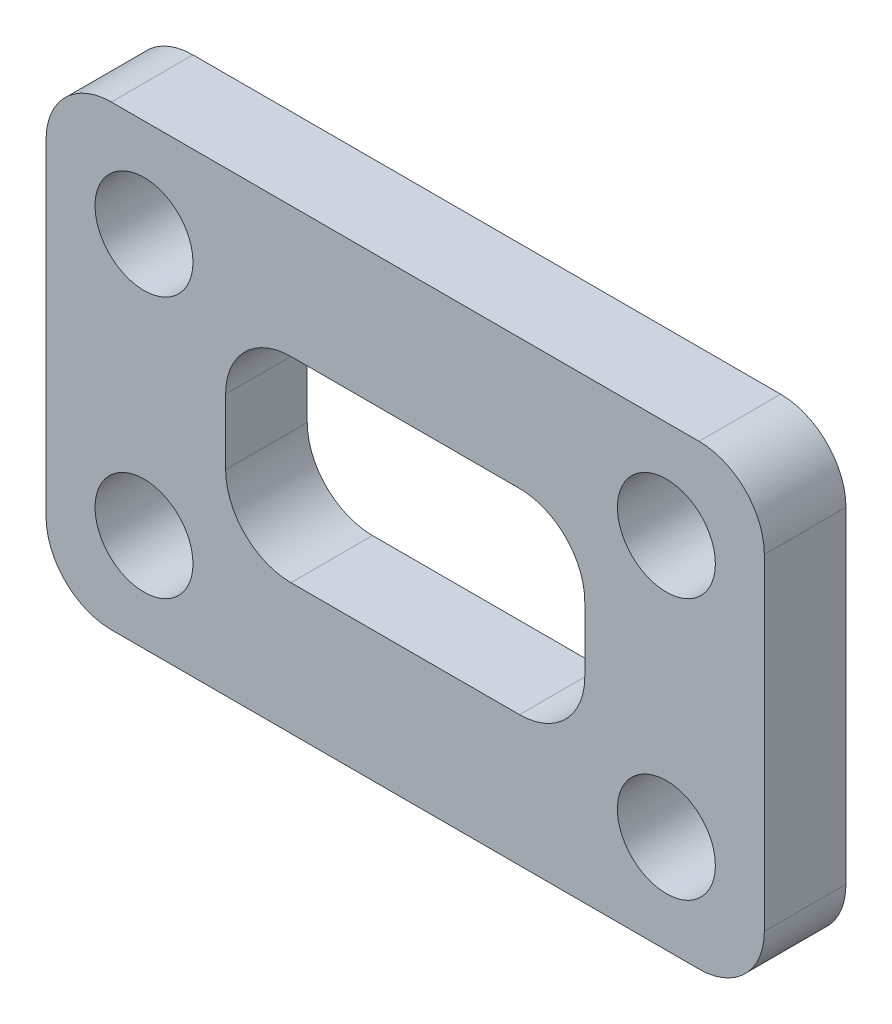
ISO-10303-21;
HEADER;
FILE_DESCRIPTION(('STEP AP214'),'2;1');
FILE_NAME('part.step','',(''),(''),'','','');
FILE_SCHEMA(('AUTOMOTIVE_DESIGN { 1 0 10303 214 1 1 1 1 }'));
ENDSEC;
DATA;
#1=APPLICATION_CONTEXT('core data for automotive mechanical design processes');
#2=APPLICATION_PROTOCOL_DEFINITION('international standard','automotive_design',2000,#1);
#3=PRODUCT_CONTEXT('',#1,'mechanical');
#4=PRODUCT('Part','Part','',(#3));
#5=PRODUCT_RELATED_PRODUCT_CATEGORY('part','',(#4));
#6=PRODUCT_DEFINITION_FORMATION('','',#4);
#7=PRODUCT_DEFINITION_CONTEXT('part definition',#1,'design');
#8=PRODUCT_DEFINITION('design','',#6,#7);
#9=PRODUCT_DEFINITION_SHAPE('','',#8);
#10=(LENGTH_UNIT() NAMED_UNIT(*) SI_UNIT(.MILLI.,.METRE.));
#11=(NAMED_UNIT(*) PLANE_ANGLE_UNIT() SI_UNIT($,.RADIAN.));
#12=(NAMED_UNIT(*) SI_UNIT($,.STERADIAN.) SOLID_ANGLE_UNIT());
#13=UNCERTAINTY_MEASURE_WITH_UNIT(LENGTH_MEASURE(1.E-05),#10,'distance_accuracy_value','');
#14=(GEOMETRIC_REPRESENTATION_CONTEXT(3) GLOBAL_UNCERTAINTY_ASSIGNED_CONTEXT((#13)) GLOBAL_UNIT_ASSIGNED_CONTEXT((#10,
#11,#12)) REPRESENTATION_CONTEXT('',''));
#15=CARTESIAN_POINT('',(0.,0.,0.));
#16=DIRECTION('',(0.,0.,1.));
#17=DIRECTION('',(1.,0.,0.));
#18=AXIS2_PLACEMENT_3D('',#15,#16,#17);
#19=CARTESIAN_POINT('',(0.,0.,2.5));
#20=DIRECTION('',(0.,0.,-1.));
#21=DIRECTION('',(-1.,0.,0.));
#22=AXIS2_PLACEMENT_3D('',#19,#20,#21);
#23=PLANE('',#22);
#24=CARTESIAN_POINT('',(-8.,4.,2.5));
#25=DIRECTION('',(0.,0.,1.));
#26=DIRECTION('',(1.,0.,0.));
#27=AXIS2_PLACEMENT_3D('',#24,#25,#26);
#28=CIRCLE('',#27,1.5);
#29=CARTESIAN_POINT('',(-6.5,4.,2.5));
#30=VERTEX_POINT('',#29);
#31=EDGE_CURVE('E285',#30,#30,#28,.T.);
#32=ORIENTED_EDGE('',*,*,#31,.F.);
#33=EDGE_LOOP('',(#32));
#34=FACE_BOUND('',#33,.T.);
#35=CARTESIAN_POINT('',(-8.,-4.,2.5));
#36=DIRECTION('',(0.,0.,1.));
#37=DIRECTION('',(1.,0.,0.));
#38=AXIS2_PLACEMENT_3D('',#35,#36,#37);
#39=CIRCLE('',#38,1.5);
#40=CARTESIAN_POINT('',(-6.5,-4.,2.5));
#41=VERTEX_POINT('',#40);
#42=EDGE_CURVE('E291',#41,#41,#39,.T.);
#43=ORIENTED_EDGE('',*,*,#42,.F.);
#44=EDGE_LOOP('',(#43));
#45=FACE_BOUND('',#44,.T.);
#46=CARTESIAN_POINT('',(8.,-4.,2.5));
#47=DIRECTION('',(0.,0.,1.));
#48=DIRECTION('',(1.,0.,0.));
#49=AXIS2_PLACEMENT_3D('',#46,#47,#48);
#50=CIRCLE('',#49,1.5);
#51=CARTESIAN_POINT('',(9.5,-4.,2.5));
#52=VERTEX_POINT('',#51);
#53=EDGE_CURVE('E297',#52,#52,#50,.T.);
#54=ORIENTED_EDGE('',*,*,#53,.F.);
#55=EDGE_LOOP('',(#54));
#56=FACE_BOUND('',#55,.T.);
#57=CARTESIAN_POINT('',(8.,4.,2.5));
#58=DIRECTION('',(0.,0.,1.));
#59=DIRECTION('',(1.,0.,0.));
#60=AXIS2_PLACEMENT_3D('',#57,#58,#59);
#61=CIRCLE('',#60,1.5);
#62=CARTESIAN_POINT('',(9.5,4.,2.5));
#63=VERTEX_POINT('',#62);
#64=EDGE_CURVE('E303',#63,#63,#61,.T.);
#65=ORIENTED_EDGE('',*,*,#64,.F.);
#66=EDGE_LOOP('',(#65));
#67=FACE_BOUND('',#66,.T.);
#68=DIRECTION('',(1.,0.,0.));
#69=VECTOR('',#68,1.);
#70=CARTESIAN_POINT('',(-11.,-7.,2.5));
#71=LINE('',#70,#69);
#72=CARTESIAN_POINT('',(-9.,-7.,2.5));
#73=VERTEX_POINT('',#72);
#74=CARTESIAN_POINT('',(9.,-7.,2.5));
#75=VERTEX_POINT('',#74);
#76=EDGE_CURVE('E186',#73,#75,#71,.T.);
#77=ORIENTED_EDGE('',*,*,#76,.T.);
#78=CARTESIAN_POINT('',(9.,-5.,2.5));
#79=DIRECTION('',(0.,0.,-1.));
#80=DIRECTION('',(-1.,0.,0.));
#81=AXIS2_PLACEMENT_3D('',#78,#79,#80);
#82=CIRCLE('',#81,2.);
#83=CARTESIAN_POINT('',(11.,-5.,2.5));
#84=VERTEX_POINT('',#83);
#85=EDGE_CURVE('E233',#75,#84,#82,.F.);
#86=ORIENTED_EDGE('',*,*,#85,.T.);
#87=DIRECTION('',(0.,1.,0.));
#88=VECTOR('',#87,1.);
#89=CARTESIAN_POINT('',(11.,-7.,2.5));
#90=LINE('',#89,#88);
#91=CARTESIAN_POINT('',(11.,5.,2.5));
#92=VERTEX_POINT('',#91);
#93=EDGE_CURVE('E309',#84,#92,#90,.T.);
#94=ORIENTED_EDGE('',*,*,#93,.T.);
#95=CARTESIAN_POINT('',(9.,5.,2.5));
#96=DIRECTION('',(0.,0.,-1.));
#97=DIRECTION('',(-1.,0.,0.));
#98=AXIS2_PLACEMENT_3D('',#95,#96,#97);
#99=CIRCLE('',#98,2.);
#100=CARTESIAN_POINT('',(9.,7.,2.5));
#101=VERTEX_POINT('',#100);
#102=EDGE_CURVE('E228',#92,#101,#99,.F.);
#103=ORIENTED_EDGE('',*,*,#102,.T.);
#104=DIRECTION('',(-1.,0.,0.));
#105=VECTOR('',#104,1.);
#106=CARTESIAN_POINT('',(-11.,7.,2.5));
#107=LINE('',#106,#105);
#108=CARTESIAN_POINT('',(-9.,7.,2.5));
#109=VERTEX_POINT('',#108);
#110=EDGE_CURVE('E312',#101,#109,#107,.T.);
#111=ORIENTED_EDGE('',*,*,#110,.T.);
#112=CARTESIAN_POINT('',(-9.,5.,2.5));
#113=DIRECTION('',(0.,0.,-1.));
#114=DIRECTION('',(-1.,0.,0.));
#115=AXIS2_PLACEMENT_3D('',#112,#113,#114);
#116=CIRCLE('',#115,2.);
#117=CARTESIAN_POINT('',(-11.,5.,2.5));
#118=VERTEX_POINT('',#117);
#119=EDGE_CURVE('E68',#109,#118,#116,.F.);
#120=ORIENTED_EDGE('',*,*,#119,.T.);
#121=DIRECTION('',(0.,-1.,0.));
#122=VECTOR('',#121,1.);
#123=CARTESIAN_POINT('',(-11.,-7.,2.5));
#124=LINE('',#123,#122);
#125=CARTESIAN_POINT('',(-11.,-5.,2.5));
#126=VERTEX_POINT('',#125);
#127=EDGE_CURVE('E191',#118,#126,#124,.T.);
#128=ORIENTED_EDGE('',*,*,#127,.T.);
#129=CARTESIAN_POINT('',(-9.,-5.,2.5));
#130=DIRECTION('',(0.,0.,-1.));
#131=DIRECTION('',(-1.,0.,0.));
#132=AXIS2_PLACEMENT_3D('',#129,#130,#131);
#133=CIRCLE('',#132,2.);
#134=EDGE_CURVE('E231',#126,#73,#133,.F.);
#135=ORIENTED_EDGE('',*,*,#134,.T.);
#136=EDGE_LOOP('',(#77,#86,#94,#103,#111,#120,#128,#135));
#137=FACE_BOUND('',#136,.T.);
#138=DIRECTION('',(0.,1.,0.));
#139=VECTOR('',#138,1.);
#140=CARTESIAN_POINT('',(5.49999999999999,-3.,2.5));
#141=LINE('',#140,#139);
#142=CARTESIAN_POINT('',(5.49999999999999,-1.,2.5));
#143=VERTEX_POINT('',#142);
#144=CARTESIAN_POINT('',(5.49999999999999,0.999999999999999,2.5));
#145=VERTEX_POINT('',#144);
#146=EDGE_CURVE('E274',#143,#145,#141,.T.);
#147=ORIENTED_EDGE('',*,*,#146,.F.);
#148=CARTESIAN_POINT('',(3.49999999999999,-1.,2.5));
#149=DIRECTION('',(0.,0.,-1.));
#150=DIRECTION('',(-1.,0.,0.));
#151=AXIS2_PLACEMENT_3D('',#148,#149,#150);
#152=CIRCLE('',#151,2.);
#153=CARTESIAN_POINT('',(3.49999999999999,-3.,2.5));
#154=VERTEX_POINT('',#153);
#155=EDGE_CURVE('E171',#143,#154,#152,.T.);
#156=ORIENTED_EDGE('',*,*,#155,.T.);
#157=DIRECTION('',(1.,0.,0.));
#158=VECTOR('',#157,1.);
#159=CARTESIAN_POINT('',(-5.5,-3.,2.5));
#160=LINE('',#159,#158);
#161=CARTESIAN_POINT('',(-3.5,-3.,2.5));
#162=VERTEX_POINT('',#161);
#163=EDGE_CURVE('E276',#162,#154,#160,.T.);
#164=ORIENTED_EDGE('',*,*,#163,.F.);
#165=CARTESIAN_POINT('',(-3.5,-1.,2.5));
#166=DIRECTION('',(0.,0.,-1.));
#167=DIRECTION('',(-1.,0.,0.));
#168=AXIS2_PLACEMENT_3D('',#165,#166,#167);
#169=CIRCLE('',#168,2.);
#170=CARTESIAN_POINT('',(-5.5,-1.,2.5));
#171=VERTEX_POINT('',#170);
#172=EDGE_CURVE('E172',#162,#171,#169,.T.);
#173=ORIENTED_EDGE('',*,*,#172,.T.);
#174=DIRECTION('',(0.,-1.,0.));
#175=VECTOR('',#174,1.);
#176=CARTESIAN_POINT('',(-5.5,-3.,2.5));
#177=LINE('',#176,#175);
#178=CARTESIAN_POINT('',(-5.5,0.999999999999999,2.5));
#179=VERTEX_POINT('',#178);
#180=EDGE_CURVE('E270',#179,#171,#177,.T.);
#181=ORIENTED_EDGE('',*,*,#180,.F.);
#182=CARTESIAN_POINT('',(-3.5,1.,2.5));
#183=DIRECTION('',(0.,0.,-1.));
#184=DIRECTION('',(-1.,0.,0.));
#185=AXIS2_PLACEMENT_3D('',#182,#183,#184);
#186=CIRCLE('',#185,2.);
#187=CARTESIAN_POINT('',(-3.5,3.,2.5));
#188=VERTEX_POINT('',#187);
#189=EDGE_CURVE('E11',#179,#188,#186,.T.);
#190=ORIENTED_EDGE('',*,*,#189,.T.);
#191=DIRECTION('',(-1.,0.,0.));
#192=VECTOR('',#191,1.);
#193=CARTESIAN_POINT('',(-5.5,3.,2.5));
#194=LINE('',#193,#192);
#195=CARTESIAN_POINT('',(3.49999999999999,3.,2.5));
#196=VERTEX_POINT('',#195);
#197=EDGE_CURVE('E268',#196,#188,#194,.T.);
#198=ORIENTED_EDGE('',*,*,#197,.F.);
#199=CARTESIAN_POINT('',(3.49999999999999,1.,2.5));
#200=DIRECTION('',(0.,0.,-1.));
#201=DIRECTION('',(-1.,0.,0.));
#202=AXIS2_PLACEMENT_3D('',#199,#200,#201);
#203=CIRCLE('',#202,2.);
#204=EDGE_CURVE('E246',#196,#145,#203,.T.);
#205=ORIENTED_EDGE('',*,*,#204,.T.);
#206=EDGE_LOOP('',(#147,#156,#164,#173,#181,#190,#198,#205));
#207=FACE_BOUND('',#206,.T.);
#208=ADVANCED_FACE('F46',(#34,#45,#56,#67,#137,#207),#23,.F.);
#209=CARTESIAN_POINT('',(0.,0.,0.));
#210=DIRECTION('',(0.,0.,-1.));
#211=DIRECTION('',(-1.,0.,0.));
#212=AXIS2_PLACEMENT_3D('',#209,#210,#211);
#213=PLANE('',#212);
#214=CARTESIAN_POINT('',(-8.,-4.,0.));
#215=DIRECTION('',(0.,0.,1.));
#216=DIRECTION('',(1.,0.,0.));
#217=AXIS2_PLACEMENT_3D('',#214,#215,#216);
#218=CIRCLE('',#217,1.5);
#219=CARTESIAN_POINT('',(-6.5,-4.,0.));
#220=VERTEX_POINT('',#219);
#221=EDGE_CURVE('E288',#220,#220,#218,.T.);
#222=ORIENTED_EDGE('',*,*,#221,.T.);
#223=EDGE_LOOP('',(#222));
#224=FACE_BOUND('',#223,.T.);
#225=CARTESIAN_POINT('',(8.,4.,0.));
#226=DIRECTION('',(0.,0.,1.));
#227=DIRECTION('',(1.,0.,0.));
#228=AXIS2_PLACEMENT_3D('',#225,#226,#227);
#229=CIRCLE('',#228,1.5);
#230=CARTESIAN_POINT('',(9.5,4.,0.));
#231=VERTEX_POINT('',#230);
#232=EDGE_CURVE('E300',#231,#231,#229,.T.);
#233=ORIENTED_EDGE('',*,*,#232,.T.);
#234=EDGE_LOOP('',(#233));
#235=FACE_BOUND('',#234,.T.);
#236=DIRECTION('',(0.,1.,0.));
#237=VECTOR('',#236,1.);
#238=CARTESIAN_POINT('',(11.,-7.,0.));
#239=LINE('',#238,#237);
#240=CARTESIAN_POINT('',(11.,-5.,0.));
#241=VERTEX_POINT('',#240);
#242=CARTESIAN_POINT('',(11.,5.,0.));
#243=VERTEX_POINT('',#242);
#244=EDGE_CURVE('E306',#241,#243,#239,.T.);
#245=ORIENTED_EDGE('',*,*,#244,.F.);
#246=CARTESIAN_POINT('',(9.,-5.,0.));
#247=DIRECTION('',(0.,0.,-1.));
#248=DIRECTION('',(-1.,0.,0.));
#249=AXIS2_PLACEMENT_3D('',#246,#247,#248);
#250=CIRCLE('',#249,2.);
#251=CARTESIAN_POINT('',(9.,-7.,0.));
#252=VERTEX_POINT('',#251);
#253=EDGE_CURVE('E221',#241,#252,#250,.T.);
#254=ORIENTED_EDGE('',*,*,#253,.T.);
#255=DIRECTION('',(1.,0.,0.));
#256=VECTOR('',#255,1.);
#257=CARTESIAN_POINT('',(-11.,-7.,0.));
#258=LINE('',#257,#256);
#259=CARTESIAN_POINT('',(-9.,-7.,0.));
#260=VERTEX_POINT('',#259);
#261=EDGE_CURVE('E194',#260,#252,#258,.T.);
#262=ORIENTED_EDGE('',*,*,#261,.F.);
#263=CARTESIAN_POINT('',(-9.,-5.,0.));
#264=DIRECTION('',(0.,0.,-1.));
#265=DIRECTION('',(-1.,0.,0.));
#266=AXIS2_PLACEMENT_3D('',#263,#264,#265);
#267=CIRCLE('',#266,2.);
#268=CARTESIAN_POINT('',(-11.,-5.,0.));
#269=VERTEX_POINT('',#268);
#270=EDGE_CURVE('E219',#260,#269,#267,.T.);
#271=ORIENTED_EDGE('',*,*,#270,.T.);
#272=DIRECTION('',(0.,-1.,0.));
#273=VECTOR('',#272,1.);
#274=CARTESIAN_POINT('',(-11.,-7.,0.));
#275=LINE('',#274,#273);
#276=CARTESIAN_POINT('',(-11.,5.,0.));
#277=VERTEX_POINT('',#276);
#278=EDGE_CURVE('E319',#277,#269,#275,.T.);
#279=ORIENTED_EDGE('',*,*,#278,.F.);
#280=CARTESIAN_POINT('',(-9.,5.,0.));
#281=DIRECTION('',(0.,0.,-1.));
#282=DIRECTION('',(-1.,0.,0.));
#283=AXIS2_PLACEMENT_3D('',#280,#281,#282);
#284=CIRCLE('',#283,2.);
#285=CARTESIAN_POINT('',(-9.,7.,0.));
#286=VERTEX_POINT('',#285);
#287=EDGE_CURVE('E217',#277,#286,#284,.T.);
#288=ORIENTED_EDGE('',*,*,#287,.T.);
#289=DIRECTION('',(-1.,0.,0.));
#290=VECTOR('',#289,1.);
#291=CARTESIAN_POINT('',(-11.,7.,0.));
#292=LINE('',#291,#290);
#293=CARTESIAN_POINT('',(9.,7.,0.));
#294=VERTEX_POINT('',#293);
#295=EDGE_CURVE('E317',#294,#286,#292,.T.);
#296=ORIENTED_EDGE('',*,*,#295,.F.);
#297=CARTESIAN_POINT('',(9.,5.,0.));
#298=DIRECTION('',(0.,0.,-1.));
#299=DIRECTION('',(-1.,0.,0.));
#300=AXIS2_PLACEMENT_3D('',#297,#298,#299);
#301=CIRCLE('',#300,2.);
#302=EDGE_CURVE('E215',#294,#243,#301,.T.);
#303=ORIENTED_EDGE('',*,*,#302,.T.);
#304=EDGE_LOOP('',(#245,#254,#262,#271,#279,#288,#296,#303));
#305=FACE_BOUND('',#304,.T.);
#306=CARTESIAN_POINT('',(8.,-4.,0.));
#307=DIRECTION('',(0.,0.,1.));
#308=DIRECTION('',(1.,0.,0.));
#309=AXIS2_PLACEMENT_3D('',#306,#307,#308);
#310=CIRCLE('',#309,1.5);
#311=CARTESIAN_POINT('',(9.5,-4.,0.));
#312=VERTEX_POINT('',#311);
#313=EDGE_CURVE('E294',#312,#312,#310,.T.);
#314=ORIENTED_EDGE('',*,*,#313,.T.);
#315=EDGE_LOOP('',(#314));
#316=FACE_BOUND('',#315,.T.);
#317=CARTESIAN_POINT('',(-8.,4.,0.));
#318=DIRECTION('',(0.,0.,1.));
#319=DIRECTION('',(1.,0.,0.));
#320=AXIS2_PLACEMENT_3D('',#317,#318,#319);
#321=CIRCLE('',#320,1.5);
#322=CARTESIAN_POINT('',(-6.5,4.,0.));
#323=VERTEX_POINT('',#322);
#324=EDGE_CURVE('E281',#323,#323,#321,.T.);
#325=ORIENTED_EDGE('',*,*,#324,.T.);
#326=EDGE_LOOP('',(#325));
#327=FACE_BOUND('',#326,.T.);
#328=DIRECTION('',(0.,-1.,0.));
#329=VECTOR('',#328,1.);
#330=CARTESIAN_POINT('',(-5.5,-3.,0.));
#331=LINE('',#330,#329);
#332=CARTESIAN_POINT('',(-5.5,0.999999999999999,0.));
#333=VERTEX_POINT('',#332);
#334=CARTESIAN_POINT('',(-5.5,-1.,0.));
#335=VERTEX_POINT('',#334);
#336=EDGE_CURVE('E253',#333,#335,#331,.T.);
#337=ORIENTED_EDGE('',*,*,#336,.T.);
#338=CARTESIAN_POINT('',(-3.5,-1.,0.));
#339=DIRECTION('',(0.,0.,-1.));
#340=DIRECTION('',(-1.,0.,0.));
#341=AXIS2_PLACEMENT_3D('',#338,#339,#340);
#342=CIRCLE('',#341,2.);
#343=CARTESIAN_POINT('',(-3.5,-3.,0.));
#344=VERTEX_POINT('',#343);
#345=EDGE_CURVE('E248',#335,#344,#342,.F.);
#346=ORIENTED_EDGE('',*,*,#345,.T.);
#347=DIRECTION('',(1.,0.,0.));
#348=VECTOR('',#347,1.);
#349=CARTESIAN_POINT('',(-5.5,-3.,0.));
#350=LINE('',#349,#348);
#351=CARTESIAN_POINT('',(3.49999999999999,-3.,0.));
#352=VERTEX_POINT('',#351);
#353=EDGE_CURVE('E166',#344,#352,#350,.T.);
#354=ORIENTED_EDGE('',*,*,#353,.T.);
#355=CARTESIAN_POINT('',(3.49999999999999,-1.,0.));
#356=DIRECTION('',(0.,0.,-1.));
#357=DIRECTION('',(-1.,0.,0.));
#358=AXIS2_PLACEMENT_3D('',#355,#356,#357);
#359=CIRCLE('',#358,2.);
#360=CARTESIAN_POINT('',(5.49999999999999,-1.,0.));
#361=VERTEX_POINT('',#360);
#362=EDGE_CURVE('E160',#352,#361,#359,.F.);
#363=ORIENTED_EDGE('',*,*,#362,.T.);
#364=DIRECTION('',(0.,1.,0.));
#365=VECTOR('',#364,1.);
#366=CARTESIAN_POINT('',(5.49999999999999,-3.,0.));
#367=LINE('',#366,#365);
#368=CARTESIAN_POINT('',(5.49999999999999,0.999999999999999,0.));
#369=VERTEX_POINT('',#368);
#370=EDGE_CURVE('E164',#361,#369,#367,.T.);
#371=ORIENTED_EDGE('',*,*,#370,.T.);
#372=CARTESIAN_POINT('',(3.49999999999999,1.,0.));
#373=DIRECTION('',(0.,0.,-1.));
#374=DIRECTION('',(-1.,0.,0.));
#375=AXIS2_PLACEMENT_3D('',#372,#373,#374);
#376=CIRCLE('',#375,2.);
#377=CARTESIAN_POINT('',(3.49999999999999,3.,0.));
#378=VERTEX_POINT('',#377);
#379=EDGE_CURVE('E244',#369,#378,#376,.F.);
#380=ORIENTED_EDGE('',*,*,#379,.T.);
#381=DIRECTION('',(-1.,0.,0.));
#382=VECTOR('',#381,1.);
#383=CARTESIAN_POINT('',(-5.5,3.,0.));
#384=LINE('',#383,#382);
#385=CARTESIAN_POINT('',(-3.5,3.,0.));
#386=VERTEX_POINT('',#385);
#387=EDGE_CURVE('E182',#378,#386,#384,.T.);
#388=ORIENTED_EDGE('',*,*,#387,.T.);
#389=CARTESIAN_POINT('',(-3.5,1.,0.));
#390=DIRECTION('',(0.,0.,-1.));
#391=DIRECTION('',(-1.,0.,0.));
#392=AXIS2_PLACEMENT_3D('',#389,#390,#391);
#393=CIRCLE('',#392,2.);
#394=EDGE_CURVE('E54',#386,#333,#393,.F.);
#395=ORIENTED_EDGE('',*,*,#394,.T.);
#396=EDGE_LOOP('',(#337,#346,#354,#363,#371,#380,#388,#395));
#397=FACE_BOUND('',#396,.T.);
#398=ADVANCED_FACE('F163',(#224,#235,#305,#316,#327,#397),#213,.T.);
#399=CARTESIAN_POINT('',(11.,-7.,2.5));
#400=DIRECTION('',(-1.,0.,0.));
#401=DIRECTION('',(0.,0.,1.));
#402=AXIS2_PLACEMENT_3D('',#399,#400,#401);
#403=PLANE('',#402);
#404=ORIENTED_EDGE('',*,*,#93,.F.);
#405=DIRECTION('',(0.,0.,-1.));
#406=VECTOR('',#405,1.);
#407=CARTESIAN_POINT('',(11.,-5.,2.5));
#408=LINE('',#407,#406);
#409=EDGE_CURVE('E212',#84,#241,#408,.T.);
#410=ORIENTED_EDGE('',*,*,#409,.T.);
#411=ORIENTED_EDGE('',*,*,#244,.T.);
#412=DIRECTION('',(0.,0.,-1.));
#413=VECTOR('',#412,1.);
#414=CARTESIAN_POINT('',(11.,5.,2.5));
#415=LINE('',#414,#413);
#416=EDGE_CURVE('E210',#243,#92,#415,.F.);
#417=ORIENTED_EDGE('',*,*,#416,.T.);
#418=EDGE_LOOP('',(#404,#410,#411,#417));
#419=FACE_BOUND('',#418,.T.);
#420=ADVANCED_FACE('F336',(#419),#403,.F.);
#421=CARTESIAN_POINT('',(-11.,7.,2.5));
#422=DIRECTION('',(0.,-1.,0.));
#423=DIRECTION('',(0.,0.,-1.));
#424=AXIS2_PLACEMENT_3D('',#421,#422,#423);
#425=PLANE('',#424);
#426=ORIENTED_EDGE('',*,*,#295,.T.);
#427=DIRECTION('',(0.,0.,-1.));
#428=VECTOR('',#427,1.);
#429=CARTESIAN_POINT('',(-9.,7.,2.5));
#430=LINE('',#429,#428);
#431=EDGE_CURVE('E242',#286,#109,#430,.F.);
#432=ORIENTED_EDGE('',*,*,#431,.T.);
#433=ORIENTED_EDGE('',*,*,#110,.F.);
#434=DIRECTION('',(0.,0.,-1.));
#435=VECTOR('',#434,1.);
#436=CARTESIAN_POINT('',(9.,7.,2.5));
#437=LINE('',#436,#435);
#438=EDGE_CURVE('E239',#101,#294,#437,.T.);
#439=ORIENTED_EDGE('',*,*,#438,.T.);
#440=EDGE_LOOP('',(#426,#432,#433,#439));
#441=FACE_BOUND('',#440,.T.);
#442=ADVANCED_FACE('F344',(#441),#425,.F.);
#443=CARTESIAN_POINT('',(-11.,-7.,2.5));
#444=DIRECTION('',(1.,0.,0.));
#445=DIRECTION('',(0.,0.,-1.));
#446=AXIS2_PLACEMENT_3D('',#443,#444,#445);
#447=PLANE('',#446);
#448=ORIENTED_EDGE('',*,*,#278,.T.);
#449=DIRECTION('',(0.,0.,-1.));
#450=VECTOR('',#449,1.);
#451=CARTESIAN_POINT('',(-11.,-5.,2.5));
#452=LINE('',#451,#450);
#453=EDGE_CURVE('E61',#269,#126,#452,.F.);
#454=ORIENTED_EDGE('',*,*,#453,.T.);
#455=ORIENTED_EDGE('',*,*,#127,.F.);
#456=DIRECTION('',(0.,0.,-1.));
#457=VECTOR('',#456,1.);
#458=CARTESIAN_POINT('',(-11.,5.,2.5));
#459=LINE('',#458,#457);
#460=EDGE_CURVE('E235',#118,#277,#459,.T.);
#461=ORIENTED_EDGE('',*,*,#460,.T.);
#462=EDGE_LOOP('',(#448,#454,#455,#461));
#463=FACE_BOUND('',#462,.T.);
#464=ADVANCED_FACE('F350',(#463),#447,.F.);
#465=CARTESIAN_POINT('',(-11.,-7.,2.5));
#466=DIRECTION('',(0.,1.,0.));
#467=DIRECTION('',(0.,0.,1.));
#468=AXIS2_PLACEMENT_3D('',#465,#466,#467);
#469=PLANE('',#468);
#470=ORIENTED_EDGE('',*,*,#261,.T.);
#471=DIRECTION('',(0.,0.,-1.));
#472=VECTOR('',#471,1.);
#473=CARTESIAN_POINT('',(9.,-7.,2.5));
#474=LINE('',#473,#472);
#475=EDGE_CURVE('E226',#252,#75,#474,.F.);
#476=ORIENTED_EDGE('',*,*,#475,.T.);
#477=ORIENTED_EDGE('',*,*,#76,.F.);
#478=DIRECTION('',(0.,0.,-1.));
#479=VECTOR('',#478,1.);
#480=CARTESIAN_POINT('',(-9.,-7.,2.5));
#481=LINE('',#480,#479);
#482=EDGE_CURVE('E223',#73,#260,#481,.T.);
#483=ORIENTED_EDGE('',*,*,#482,.T.);
#484=EDGE_LOOP('',(#470,#476,#477,#483));
#485=FACE_BOUND('',#484,.T.);
#486=ADVANCED_FACE('F325',(#485),#469,.F.);
#487=CARTESIAN_POINT('',(8.,4.,2.5));
#488=DIRECTION('',(0.,0.,-1.));
#489=DIRECTION('',(-1.,0.,0.));
#490=AXIS2_PLACEMENT_3D('',#487,#488,#489);
#491=CYLINDRICAL_SURFACE('',#490,1.5);
#492=ORIENTED_EDGE('',*,*,#64,.T.);
#493=EDGE_LOOP('',(#492));
#494=FACE_BOUND('',#493,.T.);
#495=ORIENTED_EDGE('',*,*,#232,.F.);
#496=EDGE_LOOP('',(#495));
#497=FACE_BOUND('',#496,.T.);
#498=ADVANCED_FACE('F374',(#494,#497),#491,.F.);
#499=CARTESIAN_POINT('',(8.,-4.,2.5));
#500=DIRECTION('',(0.,0.,-1.));
#501=DIRECTION('',(-1.,0.,0.));
#502=AXIS2_PLACEMENT_3D('',#499,#500,#501);
#503=CYLINDRICAL_SURFACE('',#502,1.5);
#504=ORIENTED_EDGE('',*,*,#53,.T.);
#505=EDGE_LOOP('',(#504));
#506=FACE_BOUND('',#505,.T.);
#507=ORIENTED_EDGE('',*,*,#313,.F.);
#508=EDGE_LOOP('',(#507));
#509=FACE_BOUND('',#508,.T.);
#510=ADVANCED_FACE('F505',(#506,#509),#503,.F.);
#511=CARTESIAN_POINT('',(-8.,-4.,2.5));
#512=DIRECTION('',(0.,0.,-1.));
#513=DIRECTION('',(-1.,0.,0.));
#514=AXIS2_PLACEMENT_3D('',#511,#512,#513);
#515=CYLINDRICAL_SURFACE('',#514,1.5);
#516=ORIENTED_EDGE('',*,*,#42,.T.);
#517=EDGE_LOOP('',(#516));
#518=FACE_BOUND('',#517,.T.);
#519=ORIENTED_EDGE('',*,*,#221,.F.);
#520=EDGE_LOOP('',(#519));
#521=FACE_BOUND('',#520,.T.);
#522=ADVANCED_FACE('F495',(#518,#521),#515,.F.);
#523=CARTESIAN_POINT('',(-8.,4.,2.5));
#524=DIRECTION('',(0.,0.,-1.));
#525=DIRECTION('',(-1.,0.,0.));
#526=AXIS2_PLACEMENT_3D('',#523,#524,#525);
#527=CYLINDRICAL_SURFACE('',#526,1.5);
#528=ORIENTED_EDGE('',*,*,#31,.T.);
#529=EDGE_LOOP('',(#528));
#530=FACE_BOUND('',#529,.T.);
#531=ORIENTED_EDGE('',*,*,#324,.F.);
#532=EDGE_LOOP('',(#531));
#533=FACE_BOUND('',#532,.T.);
#534=ADVANCED_FACE('F486',(#530,#533),#527,.F.);
#535=CARTESIAN_POINT('',(5.49999999999999,-3.,2.5));
#536=DIRECTION('',(-1.,0.,0.));
#537=DIRECTION('',(0.,0.,1.));
#538=AXIS2_PLACEMENT_3D('',#535,#536,#537);
#539=PLANE('',#538);
#540=ORIENTED_EDGE('',*,*,#146,.T.);
#541=DIRECTION('',(0.,0.,-1.));
#542=VECTOR('',#541,1.);
#543=CARTESIAN_POINT('',(5.49999999999999,1.,0.));
#544=LINE('',#543,#542);
#545=EDGE_CURVE('E181',#145,#369,#544,.T.);
#546=ORIENTED_EDGE('',*,*,#545,.T.);
#547=ORIENTED_EDGE('',*,*,#370,.F.);
#548=DIRECTION('',(0.,0.,-1.));
#549=VECTOR('',#548,1.);
#550=CARTESIAN_POINT('',(5.49999999999999,-1.,2.5));
#551=LINE('',#550,#549);
#552=EDGE_CURVE('E178',#361,#143,#551,.F.);
#553=ORIENTED_EDGE('',*,*,#552,.T.);
#554=EDGE_LOOP('',(#540,#546,#547,#553));
#555=FACE_BOUND('',#554,.T.);
#556=ADVANCED_FACE('F177',(#555),#539,.T.);
#557=CARTESIAN_POINT('',(-5.5,3.,2.5));
#558=DIRECTION('',(0.,-1.,0.));
#559=DIRECTION('',(0.,0.,-1.));
#560=AXIS2_PLACEMENT_3D('',#557,#558,#559);
#561=PLANE('',#560);
#562=ORIENTED_EDGE('',*,*,#387,.F.);
#563=DIRECTION('',(0.,0.,-1.));
#564=VECTOR('',#563,1.);
#565=CARTESIAN_POINT('',(3.49999999999999,3.,2.5));
#566=LINE('',#565,#564);
#567=EDGE_CURVE('E199',#378,#196,#566,.F.);
#568=ORIENTED_EDGE('',*,*,#567,.T.);
#569=ORIENTED_EDGE('',*,*,#197,.T.);
#570=DIRECTION('',(0.,0.,-1.));
#571=VECTOR('',#570,1.);
#572=CARTESIAN_POINT('',(-3.5,3.,0.));
#573=LINE('',#572,#571);
#574=EDGE_CURVE('E188',#188,#386,#573,.T.);
#575=ORIENTED_EDGE('',*,*,#574,.T.);
#576=EDGE_LOOP('',(#562,#568,#569,#575));
#577=FACE_BOUND('',#576,.T.);
#578=ADVANCED_FACE('F272',(#577),#561,.T.);
#579=CARTESIAN_POINT('',(-5.5,-3.,2.5));
#580=DIRECTION('',(1.,0.,0.));
#581=DIRECTION('',(0.,0.,-1.));
#582=AXIS2_PLACEMENT_3D('',#579,#580,#581);
#583=PLANE('',#582);
#584=ORIENTED_EDGE('',*,*,#180,.T.);
#585=DIRECTION('',(0.,0.,-1.));
#586=VECTOR('',#585,1.);
#587=CARTESIAN_POINT('',(-5.5,-1.,0.));
#588=LINE('',#587,#586);
#589=EDGE_CURVE('E203',#171,#335,#588,.T.);
#590=ORIENTED_EDGE('',*,*,#589,.T.);
#591=ORIENTED_EDGE('',*,*,#336,.F.);
#592=DIRECTION('',(0.,0.,-1.));
#593=VECTOR('',#592,1.);
#594=CARTESIAN_POINT('',(-5.5,1.,2.5));
#595=LINE('',#594,#593);
#596=EDGE_CURVE('E201',#333,#179,#595,.F.);
#597=ORIENTED_EDGE('',*,*,#596,.T.);
#598=EDGE_LOOP('',(#584,#590,#591,#597));
#599=FACE_BOUND('',#598,.T.);
#600=ADVANCED_FACE('F260',(#599),#583,.T.);
#601=CARTESIAN_POINT('',(-5.5,-3.,2.5));
#602=DIRECTION('',(0.,1.,0.));
#603=DIRECTION('',(0.,0.,1.));
#604=AXIS2_PLACEMENT_3D('',#601,#602,#603);
#605=PLANE('',#604);
#606=ORIENTED_EDGE('',*,*,#353,.F.);
#607=DIRECTION('',(0.,0.,-1.));
#608=VECTOR('',#607,1.);
#609=CARTESIAN_POINT('',(-3.5,-3.,2.5));
#610=LINE('',#609,#608);
#611=EDGE_CURVE('E208',#344,#162,#610,.F.);
#612=ORIENTED_EDGE('',*,*,#611,.T.);
#613=ORIENTED_EDGE('',*,*,#163,.T.);
#614=DIRECTION('',(0.,0.,-1.));
#615=VECTOR('',#614,1.);
#616=CARTESIAN_POINT('',(3.49999999999999,-3.,0.));
#617=LINE('',#616,#615);
#618=EDGE_CURVE('E206',#154,#352,#617,.T.);
#619=ORIENTED_EDGE('',*,*,#618,.T.);
#620=EDGE_LOOP('',(#606,#612,#613,#619));
#621=FACE_BOUND('',#620,.T.);
#622=ADVANCED_FACE('F389',(#621),#605,.T.);
#623=CARTESIAN_POINT('',(3.49999999999999,1.,2.5));
#624=DIRECTION('',(0.,0.,1.));
#625=DIRECTION('',(1.,0.,0.));
#626=AXIS2_PLACEMENT_3D('',#623,#624,#625);
#627=CYLINDRICAL_SURFACE('',#626,2.);
#628=ORIENTED_EDGE('',*,*,#204,.F.);
#629=ORIENTED_EDGE('',*,*,#567,.F.);
#630=ORIENTED_EDGE('',*,*,#379,.F.);
#631=ORIENTED_EDGE('',*,*,#545,.F.);
#632=EDGE_LOOP('',(#628,#629,#630,#631));
#633=FACE_BOUND('',#632,.T.);
#634=ADVANCED_FACE('F385',(#633),#627,.F.);
#635=CARTESIAN_POINT('',(-3.5,-1.,2.5));
#636=DIRECTION('',(0.,0.,1.));
#637=DIRECTION('',(1.,0.,0.));
#638=AXIS2_PLACEMENT_3D('',#635,#636,#637);
#639=CYLINDRICAL_SURFACE('',#638,2.);
#640=ORIENTED_EDGE('',*,*,#172,.F.);
#641=ORIENTED_EDGE('',*,*,#611,.F.);
#642=ORIENTED_EDGE('',*,*,#345,.F.);
#643=ORIENTED_EDGE('',*,*,#589,.F.);
#644=EDGE_LOOP('',(#640,#641,#642,#643));
#645=FACE_BOUND('',#644,.T.);
#646=ADVANCED_FACE('F388',(#645),#639,.F.);
#647=CARTESIAN_POINT('',(3.49999999999999,-1.,2.5));
#648=DIRECTION('',(0.,0.,1.));
#649=DIRECTION('',(1.,0.,0.));
#650=AXIS2_PLACEMENT_3D('',#647,#648,#649);
#651=CYLINDRICAL_SURFACE('',#650,2.);
#652=ORIENTED_EDGE('',*,*,#155,.F.);
#653=ORIENTED_EDGE('',*,*,#552,.F.);
#654=ORIENTED_EDGE('',*,*,#362,.F.);
#655=ORIENTED_EDGE('',*,*,#618,.F.);
#656=EDGE_LOOP('',(#652,#653,#654,#655));
#657=FACE_BOUND('',#656,.T.);
#658=ADVANCED_FACE('F185',(#657),#651,.F.);
#659=CARTESIAN_POINT('',(9.,-5.,2.5));
#660=DIRECTION('',(0.,0.,-1.));
#661=DIRECTION('',(-1.,0.,0.));
#662=AXIS2_PLACEMENT_3D('',#659,#660,#661);
#663=CYLINDRICAL_SURFACE('',#662,2.);
#664=ORIENTED_EDGE('',*,*,#85,.F.);
#665=ORIENTED_EDGE('',*,*,#475,.F.);
#666=ORIENTED_EDGE('',*,*,#253,.F.);
#667=ORIENTED_EDGE('',*,*,#409,.F.);
#668=EDGE_LOOP('',(#664,#665,#666,#667));
#669=FACE_BOUND('',#668,.T.);
#670=ADVANCED_FACE('F331',(#669),#663,.T.);
#671=CARTESIAN_POINT('',(-9.,-5.,2.5));
#672=DIRECTION('',(0.,0.,-1.));
#673=DIRECTION('',(-1.,0.,0.));
#674=AXIS2_PLACEMENT_3D('',#671,#672,#673);
#675=CYLINDRICAL_SURFACE('',#674,2.);
#676=ORIENTED_EDGE('',*,*,#134,.F.);
#677=ORIENTED_EDGE('',*,*,#453,.F.);
#678=ORIENTED_EDGE('',*,*,#270,.F.);
#679=ORIENTED_EDGE('',*,*,#482,.F.);
#680=EDGE_LOOP('',(#676,#677,#678,#679));
#681=FACE_BOUND('',#680,.T.);
#682=ADVANCED_FACE('F354',(#681),#675,.T.);
#683=CARTESIAN_POINT('',(-9.,5.,2.5));
#684=DIRECTION('',(0.,0.,-1.));
#685=DIRECTION('',(-1.,0.,0.));
#686=AXIS2_PLACEMENT_3D('',#683,#684,#685);
#687=CYLINDRICAL_SURFACE('',#686,2.);
#688=ORIENTED_EDGE('',*,*,#119,.F.);
#689=ORIENTED_EDGE('',*,*,#431,.F.);
#690=ORIENTED_EDGE('',*,*,#287,.F.);
#691=ORIENTED_EDGE('',*,*,#460,.F.);
#692=EDGE_LOOP('',(#688,#689,#690,#691));
#693=FACE_BOUND('',#692,.T.);
#694=ADVANCED_FACE('F348',(#693),#687,.T.);
#695=CARTESIAN_POINT('',(9.,5.,2.5));
#696=DIRECTION('',(0.,0.,-1.));
#697=DIRECTION('',(-1.,0.,0.));
#698=AXIS2_PLACEMENT_3D('',#695,#696,#697);
#699=CYLINDRICAL_SURFACE('',#698,2.);
#700=ORIENTED_EDGE('',*,*,#102,.F.);
#701=ORIENTED_EDGE('',*,*,#416,.F.);
#702=ORIENTED_EDGE('',*,*,#302,.F.);
#703=ORIENTED_EDGE('',*,*,#438,.F.);
#704=EDGE_LOOP('',(#700,#701,#702,#703));
#705=FACE_BOUND('',#704,.T.);
#706=ADVANCED_FACE('F340',(#705),#699,.T.);
#707=CARTESIAN_POINT('',(-3.5,1.,2.5));
#708=DIRECTION('',(0.,0.,1.));
#709=DIRECTION('',(1.,0.,0.));
#710=AXIS2_PLACEMENT_3D('',#707,#708,#709);
#711=CYLINDRICAL_SURFACE('',#710,2.);
#712=ORIENTED_EDGE('',*,*,#189,.F.);
#713=ORIENTED_EDGE('',*,*,#596,.F.);
#714=ORIENTED_EDGE('',*,*,#394,.F.);
#715=ORIENTED_EDGE('',*,*,#574,.F.);
#716=EDGE_LOOP('',(#712,#713,#714,#715));
#717=FACE_BOUND('',#716,.T.);
#718=ADVANCED_FACE('F48',(#717),#711,.F.);
#719=CLOSED_SHELL('',(#208,#398,#420,#442,#464,#486,#498,#510,#522,#534,#556,#578,#600,#622,
#634,#646,#658,#670,#682,#694,#706,#718));
#720=MANIFOLD_SOLID_BREP('B2',#719);
#721=ADVANCED_BREP_SHAPE_REPRESENTATION('',(#18,#720),#14);
#722=SHAPE_DEFINITION_REPRESENTATION(#9,#721);
ENDSEC;
END-ISO-10303-21;
